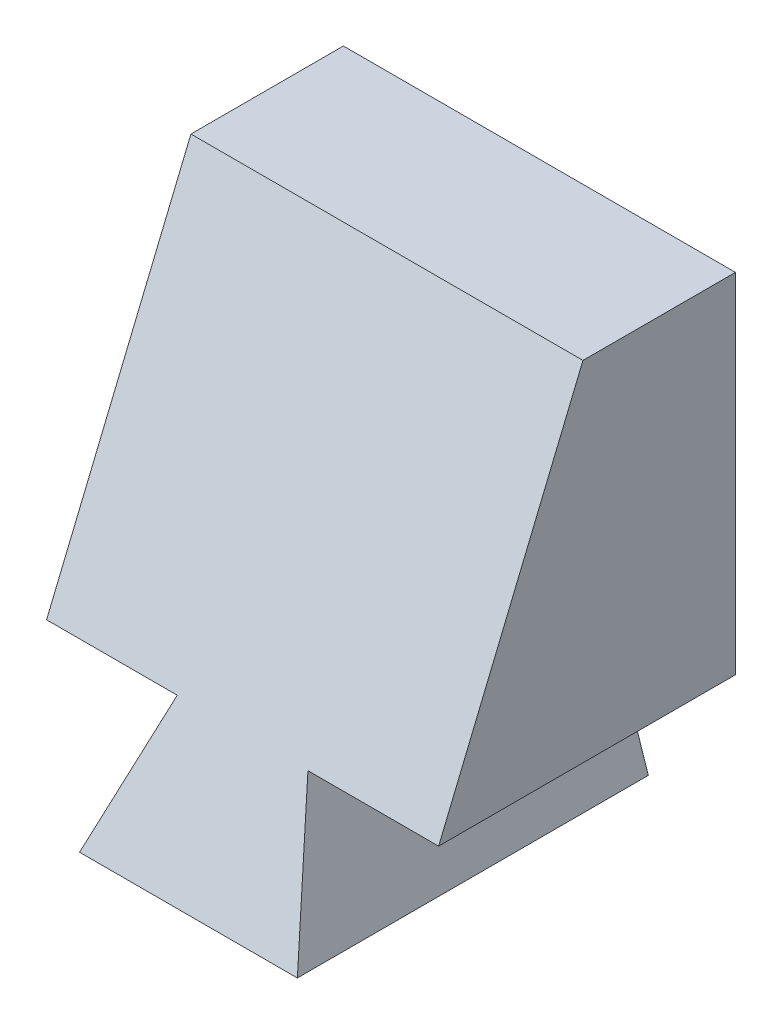
ISO-10303-21;
HEADER;
FILE_DESCRIPTION(('STEP AP214'),'2;1');
FILE_NAME('part.step','',(''),(''),'','','');
FILE_SCHEMA(('AUTOMOTIVE_DESIGN { 1 0 10303 214 1 1 1 1 }'));
ENDSEC;
DATA;
#1=APPLICATION_CONTEXT('core data for automotive mechanical design processes');
#2=APPLICATION_PROTOCOL_DEFINITION('international standard','automotive_design',2000,#1);
#3=PRODUCT_CONTEXT('',#1,'mechanical');
#4=PRODUCT('Part','Part','',(#3));
#5=PRODUCT_RELATED_PRODUCT_CATEGORY('part','',(#4));
#6=PRODUCT_DEFINITION_FORMATION('','',#4);
#7=PRODUCT_DEFINITION_CONTEXT('part definition',#1,'design');
#8=PRODUCT_DEFINITION('design','',#6,#7);
#9=PRODUCT_DEFINITION_SHAPE('','',#8);
#10=(LENGTH_UNIT() NAMED_UNIT(*) SI_UNIT(.MILLI.,.METRE.));
#11=(NAMED_UNIT(*) PLANE_ANGLE_UNIT() SI_UNIT($,.RADIAN.));
#12=(NAMED_UNIT(*) SI_UNIT($,.STERADIAN.) SOLID_ANGLE_UNIT());
#13=UNCERTAINTY_MEASURE_WITH_UNIT(LENGTH_MEASURE(1.E-05),#10,'distance_accuracy_value','');
#14=(GEOMETRIC_REPRESENTATION_CONTEXT(3) GLOBAL_UNCERTAINTY_ASSIGNED_CONTEXT((#13)) GLOBAL_UNIT_ASSIGNED_CONTEXT((#10,
#11,#12)) REPRESENTATION_CONTEXT('',''));
#15=CARTESIAN_POINT('',(0.,0.,0.));
#16=DIRECTION('',(0.,0.,1.));
#17=DIRECTION('',(1.,0.,0.));
#18=AXIS2_PLACEMENT_3D('',#15,#16,#17);
#19=CARTESIAN_POINT('',(3.79694989439845,2.4047619047619,10.));
#20=DIRECTION('',(-0.948683298050514,-0.316227766016838,0.));
#21=DIRECTION('',(0.316227766016838,-0.948683298050514,0.));
#22=AXIS2_PLACEMENT_3D('',#19,#20,#21);
#23=PLANE('',#22);
#24=DIRECTION('',(-0.294319413142336,0.882958239427006,-0.365733277779741));
#25=VECTOR('',#24,1.);
#26=CARTESIAN_POINT('',(4.13992997040167,1.37582167675227,7.23990949629766));
#27=LINE('',#26,#25);
#28=CARTESIAN_POINT('',(4.79694989439845,-0.595238095238096,8.0563491861041));
#29=VERTEX_POINT('',#28);
#30=CARTESIAN_POINT('',(3.79694989439845,2.4047619047619,6.8137084989848));
#31=VERTEX_POINT('',#30);
#32=EDGE_CURVE('E181',#29,#31,#27,.T.);
#33=ORIENTED_EDGE('',*,*,#32,.F.);
#34=DIRECTION('',(0.,0.,-1.));
#35=VECTOR('',#34,1.);
#36=CARTESIAN_POINT('',(4.79694989439845,-0.595238095238095,10.));
#37=LINE('',#36,#35);
#38=CARTESIAN_POINT('',(4.79694989439845,-0.595238095238095,0.));
#39=VERTEX_POINT('',#38);
#40=EDGE_CURVE('E57',#29,#39,#37,.T.);
#41=ORIENTED_EDGE('',*,*,#40,.T.);
#42=DIRECTION('',(-0.316227766016838,0.948683298050514,0.));
#43=VECTOR('',#42,1.);
#44=CARTESIAN_POINT('',(3.79694989439845,2.4047619047619,0.));
#45=LINE('',#44,#43);
#46=CARTESIAN_POINT('',(3.79694989439845,2.4047619047619,0.));
#47=VERTEX_POINT('',#46);
#48=EDGE_CURVE('E143',#39,#47,#45,.T.);
#49=ORIENTED_EDGE('',*,*,#48,.T.);
#50=DIRECTION('',(0.,0.,-1.));
#51=VECTOR('',#50,1.);
#52=CARTESIAN_POINT('',(3.79694989439845,2.4047619047619,10.));
#53=LINE('',#52,#51);
#54=EDGE_CURVE('E11',#31,#47,#53,.T.);
#55=ORIENTED_EDGE('',*,*,#54,.F.);
#56=EDGE_LOOP('',(#33,#41,#49,#55));
#57=FACE_BOUND('',#56,.T.);
#58=ADVANCED_FACE('F35',(#57),#23,.F.);
#59=CARTESIAN_POINT('',(6.79694989439845,2.4047619047619,10.));
#60=DIRECTION('',(0.,1.,0.));
#61=DIRECTION('',(0.,0.,1.));
#62=AXIS2_PLACEMENT_3D('',#59,#60,#61);
#63=PLANE('',#62);
#64=DIRECTION('',(1.,0.,0.));
#65=VECTOR('',#64,1.);
#66=CARTESIAN_POINT('',(6.79694989439845,2.4047619047619,6.8137084989848));
#67=LINE('',#66,#65);
#68=CARTESIAN_POINT('',(6.79694989439845,2.40476190476191,6.8137084989848));
#69=VERTEX_POINT('',#68);
#70=EDGE_CURVE('E179',#31,#69,#67,.T.);
#71=ORIENTED_EDGE('',*,*,#70,.F.);
#72=ORIENTED_EDGE('',*,*,#54,.T.);
#73=DIRECTION('',(1.,0.,0.));
#74=VECTOR('',#73,1.);
#75=CARTESIAN_POINT('',(6.79694989439845,2.4047619047619,0.));
#76=LINE('',#75,#74);
#77=CARTESIAN_POINT('',(6.79694989439845,2.4047619047619,0.));
#78=VERTEX_POINT('',#77);
#79=EDGE_CURVE('E138',#47,#78,#76,.T.);
#80=ORIENTED_EDGE('',*,*,#79,.T.);
#81=DIRECTION('',(0.,0.,-1.));
#82=VECTOR('',#81,1.);
#83=CARTESIAN_POINT('',(6.79694989439845,2.4047619047619,10.));
#84=LINE('',#83,#82);
#85=EDGE_CURVE('E42',#69,#78,#84,.T.);
#86=ORIENTED_EDGE('',*,*,#85,.F.);
#87=EDGE_LOOP('',(#71,#72,#80,#86));
#88=FACE_BOUND('',#87,.T.);
#89=ADVANCED_FACE('F139',(#88),#63,.F.);
#90=CARTESIAN_POINT('',(6.79694989439845,10.4047619047619,10.));
#91=DIRECTION('',(-1.,0.,0.));
#92=DIRECTION('',(0.,-1.,0.));
#93=AXIS2_PLACEMENT_3D('',#90,#91,#92);
#94=PLANE('',#93);
#95=DIRECTION('',(0.,0.923879532511285,-0.382683432365094));
#96=VECTOR('',#95,1.);
#97=CARTESIAN_POINT('',(6.79694989439845,8.1066648659056,4.45190296114374));
#98=LINE('',#97,#96);
#99=CARTESIAN_POINT('',(6.79694989439845,10.4047619047619,3.5));
#100=VERTEX_POINT('',#99);
#101=EDGE_CURVE('E104',#69,#100,#98,.T.);
#102=ORIENTED_EDGE('',*,*,#101,.F.);
#103=ORIENTED_EDGE('',*,*,#85,.T.);
#104=DIRECTION('',(0.,1.,0.));
#105=VECTOR('',#104,1.);
#106=CARTESIAN_POINT('',(6.79694989439845,10.4047619047619,0.));
#107=LINE('',#106,#105);
#108=CARTESIAN_POINT('',(6.79694989439845,10.4047619047619,0.));
#109=VERTEX_POINT('',#108);
#110=EDGE_CURVE('E134',#78,#109,#107,.T.);
#111=ORIENTED_EDGE('',*,*,#110,.T.);
#112=DIRECTION('',(0.,0.,-1.));
#113=VECTOR('',#112,1.);
#114=CARTESIAN_POINT('',(6.79694989439845,10.4047619047619,10.));
#115=LINE('',#114,#113);
#116=EDGE_CURVE('E122',#100,#109,#115,.T.);
#117=ORIENTED_EDGE('',*,*,#116,.F.);
#118=EDGE_LOOP('',(#102,#103,#111,#117));
#119=FACE_BOUND('',#118,.T.);
#120=ADVANCED_FACE('F132',(#119),#94,.F.);
#121=CARTESIAN_POINT('',(-2.20305010560155,10.4047619047619,10.));
#122=DIRECTION('',(0.,-1.,0.));
#123=DIRECTION('',(0.,0.,-1.));
#124=AXIS2_PLACEMENT_3D('',#121,#122,#123);
#125=PLANE('',#124);
#126=DIRECTION('',(1.,0.,0.));
#127=VECTOR('',#126,1.);
#128=CARTESIAN_POINT('',(-2.20305010560155,10.4047619047619,3.5));
#129=LINE('',#128,#127);
#130=CARTESIAN_POINT('',(-2.20305010560155,10.4047619047619,3.5));
#131=VERTEX_POINT('',#130);
#132=EDGE_CURVE('E98',#131,#100,#129,.T.);
#133=ORIENTED_EDGE('',*,*,#132,.T.);
#134=ORIENTED_EDGE('',*,*,#116,.T.);
#135=DIRECTION('',(-1.,0.,0.));
#136=VECTOR('',#135,1.);
#137=CARTESIAN_POINT('',(-2.20305010560155,10.4047619047619,0.));
#138=LINE('',#137,#136);
#139=CARTESIAN_POINT('',(-2.20305010560155,10.4047619047619,0.));
#140=VERTEX_POINT('',#139);
#141=EDGE_CURVE('E120',#109,#140,#138,.T.);
#142=ORIENTED_EDGE('',*,*,#141,.T.);
#143=DIRECTION('',(0.,0.,-1.));
#144=VECTOR('',#143,1.);
#145=CARTESIAN_POINT('',(-2.20305010560155,10.4047619047619,10.));
#146=LINE('',#145,#144);
#147=EDGE_CURVE('E114',#131,#140,#146,.T.);
#148=ORIENTED_EDGE('',*,*,#147,.F.);
#149=EDGE_LOOP('',(#133,#134,#142,#148));
#150=FACE_BOUND('',#149,.T.);
#151=ADVANCED_FACE('F118',(#150),#125,.F.);
#152=CARTESIAN_POINT('',(-2.20305010560155,2.4047619047619,10.));
#153=DIRECTION('',(1.,0.,0.));
#154=DIRECTION('',(0.,0.,-1.));
#155=AXIS2_PLACEMENT_3D('',#152,#153,#154);
#156=PLANE('',#155);
#157=DIRECTION('',(0.,-0.923879532511285,0.382683432365094));
#158=VECTOR('',#157,1.);
#159=CARTESIAN_POINT('',(-2.20305010560155,2.76117896971315,6.66607571682078));
#160=LINE('',#159,#158);
#161=CARTESIAN_POINT('',(-2.20305010560155,2.4047619047619,6.8137084989848));
#162=VERTEX_POINT('',#161);
#163=EDGE_CURVE('E101',#131,#162,#160,.T.);
#164=ORIENTED_EDGE('',*,*,#163,.F.);
#165=ORIENTED_EDGE('',*,*,#147,.T.);
#166=DIRECTION('',(0.,-1.,0.));
#167=VECTOR('',#166,1.);
#168=CARTESIAN_POINT('',(-2.20305010560155,2.4047619047619,0.));
#169=LINE('',#168,#167);
#170=CARTESIAN_POINT('',(-2.20305010560155,2.4047619047619,0.));
#171=VERTEX_POINT('',#170);
#172=EDGE_CURVE('E147',#140,#171,#169,.T.);
#173=ORIENTED_EDGE('',*,*,#172,.T.);
#174=DIRECTION('',(0.,0.,-1.));
#175=VECTOR('',#174,1.);
#176=CARTESIAN_POINT('',(-2.20305010560155,2.4047619047619,10.));
#177=LINE('',#176,#175);
#178=EDGE_CURVE('E116',#162,#171,#177,.T.);
#179=ORIENTED_EDGE('',*,*,#178,.F.);
#180=EDGE_LOOP('',(#164,#165,#173,#179));
#181=FACE_BOUND('',#180,.T.);
#182=ADVANCED_FACE('F112',(#181),#156,.F.);
#183=CARTESIAN_POINT('',(0.796949894398452,2.4047619047619,10.));
#184=DIRECTION('',(0.,1.,0.));
#185=DIRECTION('',(0.,0.,1.));
#186=AXIS2_PLACEMENT_3D('',#183,#184,#185);
#187=PLANE('',#186);
#188=DIRECTION('',(1.,0.,0.));
#189=VECTOR('',#188,1.);
#190=CARTESIAN_POINT('',(0.796949894398452,2.4047619047619,6.8137084989848));
#191=LINE('',#190,#189);
#192=CARTESIAN_POINT('',(0.796949894398452,2.4047619047619,6.8137084989848));
#193=VERTEX_POINT('',#192);
#194=EDGE_CURVE('E174',#162,#193,#191,.T.);
#195=ORIENTED_EDGE('',*,*,#194,.F.);
#196=ORIENTED_EDGE('',*,*,#178,.T.);
#197=DIRECTION('',(1.,0.,0.));
#198=VECTOR('',#197,1.);
#199=CARTESIAN_POINT('',(0.796949894398452,2.4047619047619,0.));
#200=LINE('',#199,#198);
#201=CARTESIAN_POINT('',(0.796949894398452,2.4047619047619,0.));
#202=VERTEX_POINT('',#201);
#203=EDGE_CURVE('E152',#171,#202,#200,.T.);
#204=ORIENTED_EDGE('',*,*,#203,.T.);
#205=DIRECTION('',(0.,0.,-1.));
#206=VECTOR('',#205,1.);
#207=CARTESIAN_POINT('',(0.796949894398452,2.4047619047619,10.));
#208=LINE('',#207,#206);
#209=EDGE_CURVE('E125',#193,#202,#208,.T.);
#210=ORIENTED_EDGE('',*,*,#209,.F.);
#211=EDGE_LOOP('',(#195,#196,#204,#210));
#212=FACE_BOUND('',#211,.T.);
#213=ADVANCED_FACE('F170',(#212),#187,.F.);
#214=CARTESIAN_POINT('',(-0.203050105601548,-0.595238095238095,10.));
#215=DIRECTION('',(0.948683298050514,-0.316227766016838,0.));
#216=DIRECTION('',(0.316227766016838,0.948683298050514,0.));
#217=AXIS2_PLACEMENT_3D('',#214,#215,#216);
#218=PLANE('',#217);
#219=DIRECTION('',(-0.294319413142335,-0.882958239427006,0.365733277779741));
#220=VECTOR('',#219,1.);
#221=CARTESIAN_POINT('',(-0.412269351129248,-1.22289583182119,8.31633353312522));
#222=LINE('',#221,#220);
#223=CARTESIAN_POINT('',(-0.203050105601548,-0.595238095238095,8.0563491861041));
#224=VERTEX_POINT('',#223);
#225=EDGE_CURVE('E49',#193,#224,#222,.T.);
#226=ORIENTED_EDGE('',*,*,#225,.F.);
#227=ORIENTED_EDGE('',*,*,#209,.T.);
#228=DIRECTION('',(-0.316227766016838,-0.948683298050514,0.));
#229=VECTOR('',#228,1.);
#230=CARTESIAN_POINT('',(-0.203050105601548,-0.595238095238095,0.));
#231=LINE('',#230,#229);
#232=CARTESIAN_POINT('',(-0.203050105601548,-0.595238095238095,0.));
#233=VERTEX_POINT('',#232);
#234=EDGE_CURVE('E155',#202,#233,#231,.T.);
#235=ORIENTED_EDGE('',*,*,#234,.T.);
#236=DIRECTION('',(0.,0.,-1.));
#237=VECTOR('',#236,1.);
#238=CARTESIAN_POINT('',(-0.203050105601548,-0.595238095238095,10.));
#239=LINE('',#238,#237);
#240=EDGE_CURVE('E161',#224,#233,#239,.T.);
#241=ORIENTED_EDGE('',*,*,#240,.F.);
#242=EDGE_LOOP('',(#226,#227,#235,#241));
#243=FACE_BOUND('',#242,.T.);
#244=ADVANCED_FACE('F164',(#243),#218,.F.);
#245=CARTESIAN_POINT('',(4.79694989439845,-0.595238095238095,10.));
#246=DIRECTION('',(0.,1.,0.));
#247=DIRECTION('',(0.,0.,1.));
#248=AXIS2_PLACEMENT_3D('',#245,#246,#247);
#249=PLANE('',#248);
#250=DIRECTION('',(1.,0.,0.));
#251=VECTOR('',#250,1.);
#252=CARTESIAN_POINT('',(-2.20305010560155,-0.595238095238097,8.0563491861041));
#253=LINE('',#252,#251);
#254=EDGE_CURVE('E108',#224,#29,#253,.T.);
#255=ORIENTED_EDGE('',*,*,#254,.F.);
#256=ORIENTED_EDGE('',*,*,#240,.T.);
#257=DIRECTION('',(1.,0.,0.));
#258=VECTOR('',#257,1.);
#259=CARTESIAN_POINT('',(4.79694989439845,-0.595238095238095,0.));
#260=LINE('',#259,#258);
#261=EDGE_CURVE('E158',#233,#39,#260,.T.);
#262=ORIENTED_EDGE('',*,*,#261,.T.);
#263=ORIENTED_EDGE('',*,*,#40,.F.);
#264=EDGE_LOOP('',(#255,#256,#262,#263));
#265=FACE_BOUND('',#264,.T.);
#266=ADVANCED_FACE('F172',(#265),#249,.F.);
#267=CARTESIAN_POINT('',(0.,0.,0.));
#268=DIRECTION('',(0.,0.,-1.));
#269=DIRECTION('',(-1.,0.,0.));
#270=AXIS2_PLACEMENT_3D('',#267,#268,#269);
#271=PLANE('',#270);
#272=ORIENTED_EDGE('',*,*,#48,.F.);
#273=ORIENTED_EDGE('',*,*,#261,.F.);
#274=ORIENTED_EDGE('',*,*,#234,.F.);
#275=ORIENTED_EDGE('',*,*,#203,.F.);
#276=ORIENTED_EDGE('',*,*,#172,.F.);
#277=ORIENTED_EDGE('',*,*,#141,.F.);
#278=ORIENTED_EDGE('',*,*,#110,.F.);
#279=ORIENTED_EDGE('',*,*,#79,.F.);
#280=EDGE_LOOP('',(#272,#273,#274,#275,#276,#277,#278,#279));
#281=FACE_BOUND('',#280,.T.);
#282=ADVANCED_FACE('F145',(#281),#271,.T.);
#283=CARTESIAN_POINT('',(-2.20305010560155,2.76117896971315,6.66607571682078));
#284=DIRECTION('',(0.,0.382683432365094,0.923879532511285));
#285=DIRECTION('',(0.,-0.923879532511285,0.382683432365094));
#286=AXIS2_PLACEMENT_3D('',#283,#284,#285);
#287=PLANE('',#286);
#288=ORIENTED_EDGE('',*,*,#32,.T.);
#289=ORIENTED_EDGE('',*,*,#70,.T.);
#290=ORIENTED_EDGE('',*,*,#101,.T.);
#291=ORIENTED_EDGE('',*,*,#132,.F.);
#292=ORIENTED_EDGE('',*,*,#163,.T.);
#293=ORIENTED_EDGE('',*,*,#194,.T.);
#294=ORIENTED_EDGE('',*,*,#225,.T.);
#295=ORIENTED_EDGE('',*,*,#254,.T.);
#296=EDGE_LOOP('',(#288,#289,#290,#291,#292,#293,#294,#295));
#297=FACE_BOUND('',#296,.T.);
#298=ADVANCED_FACE('F100',(#297),#287,.T.);
#299=CLOSED_SHELL('',(#58,#89,#120,#151,#182,#213,#244,#266,#282,#298));
#300=MANIFOLD_SOLID_BREP('B2',#299);
#301=ADVANCED_BREP_SHAPE_REPRESENTATION('',(#18,#300),#14);
#302=SHAPE_DEFINITION_REPRESENTATION(#9,#301);
ENDSEC;
END-ISO-10303-21;
